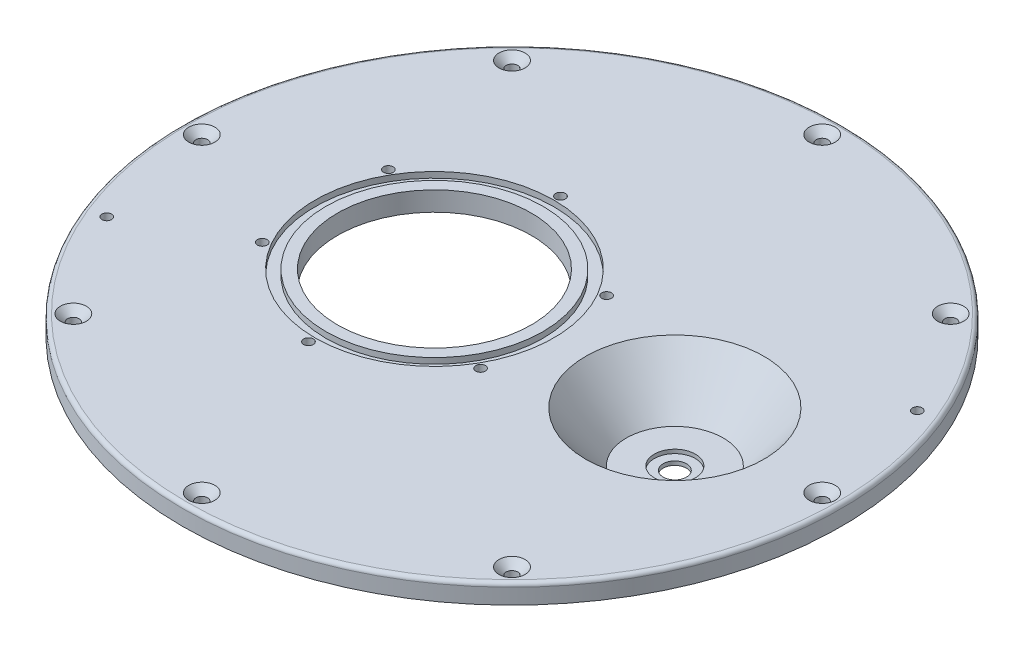
ISO-10303-21;
HEADER;
FILE_DESCRIPTION(('STEP AP214'),'2;1');
FILE_NAME('part.step','',(''),(''),'','','');
FILE_SCHEMA(('AUTOMOTIVE_DESIGN { 1 0 10303 214 1 1 1 1 }'));
ENDSEC;
DATA;
#1=APPLICATION_CONTEXT('core data for automotive mechanical design processes');
#2=APPLICATION_PROTOCOL_DEFINITION('international standard','automotive_design',2000,#1);
#3=PRODUCT_CONTEXT('',#1,'mechanical');
#4=PRODUCT('Part','Part','',(#3));
#5=PRODUCT_RELATED_PRODUCT_CATEGORY('part','',(#4));
#6=PRODUCT_DEFINITION_FORMATION('','',#4);
#7=PRODUCT_DEFINITION_CONTEXT('part definition',#1,'design');
#8=PRODUCT_DEFINITION('design','',#6,#7);
#9=PRODUCT_DEFINITION_SHAPE('','',#8);
#10=(LENGTH_UNIT() NAMED_UNIT(*) SI_UNIT(.MILLI.,.METRE.));
#11=(NAMED_UNIT(*) PLANE_ANGLE_UNIT() SI_UNIT($,.RADIAN.));
#12=(NAMED_UNIT(*) SI_UNIT($,.STERADIAN.) SOLID_ANGLE_UNIT());
#13=UNCERTAINTY_MEASURE_WITH_UNIT(LENGTH_MEASURE(1.E-05),#10,'distance_accuracy_value','');
#14=(GEOMETRIC_REPRESENTATION_CONTEXT(3) GLOBAL_UNCERTAINTY_ASSIGNED_CONTEXT((#13)) GLOBAL_UNIT_ASSIGNED_CONTEXT((#10,
#11,#12)) REPRESENTATION_CONTEXT('',''));
#15=CARTESIAN_POINT('',(0.,0.,0.));
#16=DIRECTION('',(0.,0.,1.));
#17=DIRECTION('',(1.,0.,0.));
#18=AXIS2_PLACEMENT_3D('',#15,#16,#17);
#19=CARTESIAN_POINT('',(0.,5.,0.));
#20=DIRECTION('',(0.,1.,0.));
#21=DIRECTION('',(0.,0.,1.));
#22=AXIS2_PLACEMENT_3D('',#19,#20,#21);
#23=PLANE('',#22);
#24=CARTESIAN_POINT('',(-20.,5.,0.));
#25=DIRECTION('',(0.,1.,0.));
#26=DIRECTION('',(0.,0.,1.));
#27=AXIS2_PLACEMENT_3D('',#24,#25,#26);
#28=CIRCLE('',#27,25.);
#29=CARTESIAN_POINT('',(-20.,5.,25.));
#30=VERTEX_POINT('',#29);
#31=EDGE_CURVE('E147',#30,#30,#28,.T.);
#32=ORIENTED_EDGE('',*,*,#31,.F.);
#33=EDGE_LOOP('',(#32));
#34=FACE_BOUND('',#33,.T.);
#35=CARTESIAN_POINT('',(-20.,5.,0.));
#36=DIRECTION('',(0.,1.,0.));
#37=DIRECTION('',(0.,0.,1.));
#38=AXIS2_PLACEMENT_3D('',#35,#36,#37);
#39=CIRCLE('',#38,28.);
#40=CARTESIAN_POINT('',(-20.,5.,28.));
#41=VERTEX_POINT('',#40);
#42=EDGE_CURVE('E111',#41,#41,#39,.T.);
#43=ORIENTED_EDGE('',*,*,#42,.T.);
#44=EDGE_LOOP('',(#43));
#45=FACE_BOUND('',#44,.T.);
#46=ADVANCED_FACE('F36',(#34,#45),#23,.T.);
#47=CARTESIAN_POINT('',(0.,5.,0.));
#48=DIRECTION('',(0.,-1.,0.));
#49=DIRECTION('',(0.,0.,-1.));
#50=AXIS2_PLACEMENT_3D('',#47,#48,#49);
#51=CYLINDRICAL_SURFACE('',#50,85.);
#52=CARTESIAN_POINT('',(0.,4.,0.));
#53=DIRECTION('',(0.,1.,0.));
#54=DIRECTION('',(0.,0.,1.));
#55=AXIS2_PLACEMENT_3D('',#52,#53,#54);
#56=CIRCLE('',#55,85.);
#57=CARTESIAN_POINT('',(0.,4.,85.));
#58=VERTEX_POINT('',#57);
#59=EDGE_CURVE('E11',#58,#58,#56,.F.);
#60=ORIENTED_EDGE('',*,*,#59,.T.);
#61=EDGE_LOOP('',(#60));
#62=FACE_BOUND('',#61,.T.);
#63=CARTESIAN_POINT('',(0.,0.,0.));
#64=DIRECTION('',(0.,1.,0.));
#65=DIRECTION('',(0.,0.,1.));
#66=AXIS2_PLACEMENT_3D('',#63,#64,#65);
#67=CIRCLE('',#66,85.);
#68=CARTESIAN_POINT('',(0.,0.,85.));
#69=VERTEX_POINT('',#68);
#70=EDGE_CURVE('E225',#69,#69,#67,.T.);
#71=ORIENTED_EDGE('',*,*,#70,.T.);
#72=EDGE_LOOP('',(#71));
#73=FACE_BOUND('',#72,.T.);
#74=ADVANCED_FACE('F249',(#62,#73),#51,.T.);
#75=CARTESIAN_POINT('',(-73.9103626009029,5.,30.6146745892072));
#76=DIRECTION('',(0.,1.,0.));
#77=DIRECTION('',(0.,0.,1.));
#78=AXIS2_PLACEMENT_3D('',#75,#76,#77);
#79=CIRCLE('',#78,1.24999999999999);
#80=CARTESIAN_POINT('',(-73.9103626009029,5.,31.8646745892072));
#81=VERTEX_POINT('',#80);
#82=EDGE_CURVE('E271',#81,#81,#79,.T.);
#83=ORIENTED_EDGE('',*,*,#82,.F.);
#84=EDGE_LOOP('',(#83));
#85=FACE_BOUND('',#84,.T.);
#86=CARTESIAN_POINT('',(73.9103626009029,5.,-30.6146745892073));
#87=DIRECTION('',(0.,1.,0.));
#88=DIRECTION('',(0.,0.,1.));
#89=AXIS2_PLACEMENT_3D('',#86,#87,#88);
#90=CIRCLE('',#89,1.24999999999999);
#91=CARTESIAN_POINT('',(73.9103626009029,5.,-29.3646745892073));
#92=VERTEX_POINT('',#91);
#93=EDGE_CURVE('E275',#92,#92,#90,.T.);
#94=ORIENTED_EDGE('',*,*,#93,.F.);
#95=EDGE_LOOP('',(#94));
#96=FACE_BOUND('',#95,.T.);
#97=CARTESIAN_POINT('',(-20.,5.,-32.5));
#98=DIRECTION('',(0.,1.,0.));
#99=DIRECTION('',(0.,0.,1.));
#100=AXIS2_PLACEMENT_3D('',#97,#98,#99);
#101=CIRCLE('',#100,1.24999999999999);
#102=CARTESIAN_POINT('',(-20.,5.,-31.25));
#103=VERTEX_POINT('',#102);
#104=EDGE_CURVE('E75',#103,#103,#101,.T.);
#105=ORIENTED_EDGE('',*,*,#104,.F.);
#106=EDGE_LOOP('',(#105));
#107=FACE_BOUND('',#106,.T.);
#108=CARTESIAN_POINT('',(8.14582562299452,5.,-16.2500000000003));
#109=DIRECTION('',(0.,1.,0.));
#110=DIRECTION('',(0.,0.,1.));
#111=AXIS2_PLACEMENT_3D('',#108,#109,#110);
#112=CIRCLE('',#111,1.24999999999999);
#113=CARTESIAN_POINT('',(8.14582562299452,5.,-15.0000000000003));
#114=VERTEX_POINT('',#113);
#115=EDGE_CURVE('E74',#114,#114,#112,.T.);
#116=ORIENTED_EDGE('',*,*,#115,.F.);
#117=EDGE_LOOP('',(#116));
#118=FACE_BOUND('',#117,.T.);
#119=CARTESIAN_POINT('',(8.14582562299486,5.,16.2499999999997));
#120=DIRECTION('',(0.,1.,0.));
#121=DIRECTION('',(0.,0.,1.));
#122=AXIS2_PLACEMENT_3D('',#119,#120,#121);
#123=CIRCLE('',#122,1.24999999999999);
#124=CARTESIAN_POINT('',(8.14582562299486,5.,17.4999999999997));
#125=VERTEX_POINT('',#124);
#126=EDGE_CURVE('E87',#125,#125,#123,.T.);
#127=ORIENTED_EDGE('',*,*,#126,.F.);
#128=EDGE_LOOP('',(#127));
#129=FACE_BOUND('',#128,.T.);
#130=CARTESIAN_POINT('',(-19.9999999999993,5.,32.5));
#131=DIRECTION('',(0.,1.,0.));
#132=DIRECTION('',(0.,0.,1.));
#133=AXIS2_PLACEMENT_3D('',#130,#131,#132);
#134=CIRCLE('',#133,1.24999999999999);
#135=CARTESIAN_POINT('',(-19.9999999999993,5.,33.75));
#136=VERTEX_POINT('',#135);
#137=EDGE_CURVE('E93',#136,#136,#134,.T.);
#138=ORIENTED_EDGE('',*,*,#137,.F.);
#139=EDGE_LOOP('',(#138));
#140=FACE_BOUND('',#139,.T.);
#141=CARTESIAN_POINT('',(-48.1458256229938,5.,-16.2499999999999));
#142=DIRECTION('',(0.,1.,0.));
#143=DIRECTION('',(0.,0.,1.));
#144=AXIS2_PLACEMENT_3D('',#141,#142,#143);
#145=CIRCLE('',#144,1.24999999999999);
#146=CARTESIAN_POINT('',(-48.1458256229938,5.,-15.));
#147=VERTEX_POINT('',#146);
#148=EDGE_CURVE('E99',#147,#147,#145,.T.);
#149=ORIENTED_EDGE('',*,*,#148,.F.);
#150=EDGE_LOOP('',(#149));
#151=FACE_BOUND('',#150,.T.);
#152=CARTESIAN_POINT('',(-48.1458256229937,5.,16.2500000000001));
#153=DIRECTION('',(0.,1.,0.));
#154=DIRECTION('',(0.,0.,1.));
#155=AXIS2_PLACEMENT_3D('',#152,#153,#154);
#156=CIRCLE('',#155,1.24999999999999);
#157=CARTESIAN_POINT('',(-48.1458256229937,5.,17.5000000000001));
#158=VERTEX_POINT('',#157);
#159=EDGE_CURVE('E105',#158,#158,#156,.T.);
#160=ORIENTED_EDGE('',*,*,#159,.F.);
#161=EDGE_LOOP('',(#160));
#162=FACE_BOUND('',#161,.T.);
#163=CARTESIAN_POINT('',(0.,5.,0.));
#164=DIRECTION('',(0.,1.,0.));
#165=DIRECTION('',(0.,0.,1.));
#166=AXIS2_PLACEMENT_3D('',#163,#164,#165);
#167=CIRCLE('',#166,84.);
#168=CARTESIAN_POINT('',(0.,5.,84.));
#169=VERTEX_POINT('',#168);
#170=EDGE_CURVE('E45',#169,#169,#167,.T.);
#171=ORIENTED_EDGE('',*,*,#170,.T.);
#172=EDGE_LOOP('',(#171));
#173=FACE_BOUND('',#172,.T.);
#174=CARTESIAN_POINT('',(-20.,5.,0.));
#175=DIRECTION('',(0.,1.,0.));
#176=DIRECTION('',(0.,0.,1.));
#177=AXIS2_PLACEMENT_3D('',#174,#175,#176);
#178=CIRCLE('',#177,30.8);
#179=CARTESIAN_POINT('',(-20.,5.,30.8));
#180=VERTEX_POINT('',#179);
#181=EDGE_CURVE('E115',#180,#180,#178,.T.);
#182=ORIENTED_EDGE('',*,*,#181,.F.);
#183=EDGE_LOOP('',(#182));
#184=FACE_BOUND('',#183,.T.);
#185=CARTESIAN_POINT('',(42.,5.,0.));
#186=DIRECTION('',(0.,1.,0.));
#187=DIRECTION('',(0.,0.,1.));
#188=AXIS2_PLACEMENT_3D('',#185,#186,#187);
#189=CIRCLE('',#188,23.);
#190=CARTESIAN_POINT('',(42.,5.,23.));
#191=VERTEX_POINT('',#190);
#192=EDGE_CURVE('E144',#191,#191,#189,.T.);
#193=ORIENTED_EDGE('',*,*,#192,.F.);
#194=EDGE_LOOP('',(#193));
#195=FACE_BOUND('',#194,.T.);
#196=CARTESIAN_POINT('',(0.,5.,-80.));
#197=DIRECTION('',(0.,1.,0.));
#198=DIRECTION('',(0.,0.,1.));
#199=AXIS2_PLACEMENT_3D('',#196,#197,#198);
#200=CIRCLE('',#199,3.36);
#201=CARTESIAN_POINT('',(0.,5.,-76.64));
#202=VERTEX_POINT('',#201);
#203=EDGE_CURVE('E151',#202,#202,#200,.T.);
#204=ORIENTED_EDGE('',*,*,#203,.F.);
#205=EDGE_LOOP('',(#204));
#206=FACE_BOUND('',#205,.T.);
#207=CARTESIAN_POINT('',(56.5685424949239,5.,-56.5685424949237));
#208=DIRECTION('',(0.,1.,0.));
#209=DIRECTION('',(0.,0.,1.));
#210=AXIS2_PLACEMENT_3D('',#207,#208,#209);
#211=CIRCLE('',#210,3.36);
#212=CARTESIAN_POINT('',(56.5685424949239,5.,-53.2085424949237));
#213=VERTEX_POINT('',#212);
#214=EDGE_CURVE('E162',#213,#213,#211,.T.);
#215=ORIENTED_EDGE('',*,*,#214,.F.);
#216=EDGE_LOOP('',(#215));
#217=FACE_BOUND('',#216,.T.);
#218=CARTESIAN_POINT('',(80.,5.,2.79318507107451E-13));
#219=DIRECTION('',(0.,1.,0.));
#220=DIRECTION('',(0.,0.,1.));
#221=AXIS2_PLACEMENT_3D('',#218,#219,#220);
#222=CIRCLE('',#221,3.36);
#223=CARTESIAN_POINT('',(80.,5.,3.36000000000028));
#224=VERTEX_POINT('',#223);
#225=EDGE_CURVE('E171',#224,#224,#222,.T.);
#226=ORIENTED_EDGE('',*,*,#225,.F.);
#227=EDGE_LOOP('',(#226));
#228=FACE_BOUND('',#227,.T.);
#229=CARTESIAN_POINT('',(56.5685424949235,5.,56.5685424949241));
#230=DIRECTION('',(0.,1.,0.));
#231=DIRECTION('',(0.,0.,1.));
#232=AXIS2_PLACEMENT_3D('',#229,#230,#231);
#233=CIRCLE('',#232,3.36);
#234=CARTESIAN_POINT('',(56.5685424949235,5.,59.9285424949241));
#235=VERTEX_POINT('',#234);
#236=EDGE_CURVE('E180',#235,#235,#233,.T.);
#237=ORIENTED_EDGE('',*,*,#236,.F.);
#238=EDGE_LOOP('',(#237));
#239=FACE_BOUND('',#238,.T.);
#240=CARTESIAN_POINT('',(-5.58637014214901E-13,5.,80.));
#241=DIRECTION('',(0.,1.,0.));
#242=DIRECTION('',(0.,0.,1.));
#243=AXIS2_PLACEMENT_3D('',#240,#241,#242);
#244=CIRCLE('',#243,3.36);
#245=CARTESIAN_POINT('',(-5.58637014214901E-13,5.,83.36));
#246=VERTEX_POINT('',#245);
#247=EDGE_CURVE('E189',#246,#246,#244,.T.);
#248=ORIENTED_EDGE('',*,*,#247,.F.);
#249=EDGE_LOOP('',(#248));
#250=FACE_BOUND('',#249,.T.);
#251=CARTESIAN_POINT('',(-56.5685424949243,5.,56.5685424949233));
#252=DIRECTION('',(0.,1.,0.));
#253=DIRECTION('',(0.,0.,1.));
#254=AXIS2_PLACEMENT_3D('',#251,#252,#253);
#255=CIRCLE('',#254,3.36);
#256=CARTESIAN_POINT('',(-56.5685424949243,5.,59.9285424949233));
#257=VERTEX_POINT('',#256);
#258=EDGE_CURVE('E198',#257,#257,#255,.T.);
#259=ORIENTED_EDGE('',*,*,#258,.F.);
#260=EDGE_LOOP('',(#259));
#261=FACE_BOUND('',#260,.T.);
#262=CARTESIAN_POINT('',(-56.5685424949231,5.,-56.5685424949245));
#263=DIRECTION('',(0.,1.,0.));
#264=DIRECTION('',(0.,0.,1.));
#265=AXIS2_PLACEMENT_3D('',#262,#263,#264);
#266=CIRCLE('',#265,3.36);
#267=CARTESIAN_POINT('',(-56.5685424949231,5.,-53.2085424949245));
#268=VERTEX_POINT('',#267);
#269=EDGE_CURVE('E207',#268,#268,#266,.T.);
#270=ORIENTED_EDGE('',*,*,#269,.F.);
#271=EDGE_LOOP('',(#270));
#272=FACE_BOUND('',#271,.T.);
#273=CARTESIAN_POINT('',(-80.,5.,-8.37955521322352E-13));
#274=DIRECTION('',(0.,1.,0.));
#275=DIRECTION('',(0.,0.,1.));
#276=AXIS2_PLACEMENT_3D('',#273,#274,#275);
#277=CIRCLE('',#276,3.36);
#278=CARTESIAN_POINT('',(-80.,5.,3.35999999999916));
#279=VERTEX_POINT('',#278);
#280=EDGE_CURVE('E216',#279,#279,#277,.T.);
#281=ORIENTED_EDGE('',*,*,#280,.F.);
#282=EDGE_LOOP('',(#281));
#283=FACE_BOUND('',#282,.T.);
#284=ADVANCED_FACE('F231',(#85,#96,#107,#118,#129,#140,#151,#162,#173,#184,#195,#206,#217,#228,
#239,#250,#261,#272,#283),#23,.T.);
#285=CARTESIAN_POINT('',(0.,0.,0.));
#286=DIRECTION('',(0.,1.,0.));
#287=DIRECTION('',(0.,0.,1.));
#288=AXIS2_PLACEMENT_3D('',#285,#286,#287);
#289=PLANE('',#288);
#290=CARTESIAN_POINT('',(-73.9103626009029,0.,30.6146745892072));
#291=DIRECTION('',(0.,1.,0.));
#292=DIRECTION('',(0.,0.,1.));
#293=AXIS2_PLACEMENT_3D('',#290,#291,#292);
#294=CIRCLE('',#293,1.24999999999999);
#295=CARTESIAN_POINT('',(-73.9103626009029,0.,31.8646745892072));
#296=VERTEX_POINT('',#295);
#297=EDGE_CURVE('E40',#296,#296,#294,.T.);
#298=ORIENTED_EDGE('',*,*,#297,.T.);
#299=EDGE_LOOP('',(#298));
#300=FACE_BOUND('',#299,.T.);
#301=CARTESIAN_POINT('',(73.9103626009029,0.,-30.6146745892073));
#302=DIRECTION('',(0.,1.,0.));
#303=DIRECTION('',(0.,0.,1.));
#304=AXIS2_PLACEMENT_3D('',#301,#302,#303);
#305=CIRCLE('',#304,1.24999999999999);
#306=CARTESIAN_POINT('',(73.9103626009029,0.,-29.3646745892073));
#307=VERTEX_POINT('',#306);
#308=EDGE_CURVE('E81',#307,#307,#305,.T.);
#309=ORIENTED_EDGE('',*,*,#308,.T.);
#310=EDGE_LOOP('',(#309));
#311=FACE_BOUND('',#310,.T.);
#312=CARTESIAN_POINT('',(42.,0.,0.));
#313=DIRECTION('',(0.,1.,0.));
#314=DIRECTION('',(0.,0.,1.));
#315=AXIS2_PLACEMENT_3D('',#312,#313,#314);
#316=CIRCLE('',#315,23.);
#317=CARTESIAN_POINT('',(42.,0.,23.));
#318=VERTEX_POINT('',#317);
#319=EDGE_CURVE('E121',#318,#318,#316,.T.);
#320=ORIENTED_EDGE('',*,*,#319,.T.);
#321=EDGE_LOOP('',(#320));
#322=FACE_BOUND('',#321,.T.);
#323=CARTESIAN_POINT('',(-20.,0.,0.));
#324=DIRECTION('',(0.,1.,0.));
#325=DIRECTION('',(0.,0.,1.));
#326=AXIS2_PLACEMENT_3D('',#323,#324,#325);
#327=CIRCLE('',#326,25.);
#328=CARTESIAN_POINT('',(-20.,0.,25.));
#329=VERTEX_POINT('',#328);
#330=EDGE_CURVE('E148',#329,#329,#327,.T.);
#331=ORIENTED_EDGE('',*,*,#330,.T.);
#332=EDGE_LOOP('',(#331));
#333=FACE_BOUND('',#332,.T.);
#334=CARTESIAN_POINT('',(0.,0.,-80.));
#335=DIRECTION('',(0.,1.,0.));
#336=DIRECTION('',(0.,0.,1.));
#337=AXIS2_PLACEMENT_3D('',#334,#335,#336);
#338=CIRCLE('',#337,1.5);
#339=CARTESIAN_POINT('',(0.,0.,-78.5));
#340=VERTEX_POINT('',#339);
#341=EDGE_CURVE('E159',#340,#340,#338,.T.);
#342=ORIENTED_EDGE('',*,*,#341,.T.);
#343=EDGE_LOOP('',(#342));
#344=FACE_BOUND('',#343,.T.);
#345=CARTESIAN_POINT('',(56.5685424949239,0.,-56.5685424949237));
#346=DIRECTION('',(0.,1.,0.));
#347=DIRECTION('',(0.,0.,1.));
#348=AXIS2_PLACEMENT_3D('',#345,#346,#347);
#349=CIRCLE('',#348,1.5);
#350=CARTESIAN_POINT('',(56.5685424949239,0.,-55.0685424949237));
#351=VERTEX_POINT('',#350);
#352=EDGE_CURVE('E168',#351,#351,#349,.T.);
#353=ORIENTED_EDGE('',*,*,#352,.T.);
#354=EDGE_LOOP('',(#353));
#355=FACE_BOUND('',#354,.T.);
#356=CARTESIAN_POINT('',(80.,0.,2.79318507107451E-13));
#357=DIRECTION('',(0.,1.,0.));
#358=DIRECTION('',(0.,0.,1.));
#359=AXIS2_PLACEMENT_3D('',#356,#357,#358);
#360=CIRCLE('',#359,1.5);
#361=CARTESIAN_POINT('',(80.,0.,1.50000000000028));
#362=VERTEX_POINT('',#361);
#363=EDGE_CURVE('E177',#362,#362,#360,.T.);
#364=ORIENTED_EDGE('',*,*,#363,.T.);
#365=EDGE_LOOP('',(#364));
#366=FACE_BOUND('',#365,.T.);
#367=CARTESIAN_POINT('',(56.5685424949235,0.,56.5685424949241));
#368=DIRECTION('',(0.,1.,0.));
#369=DIRECTION('',(0.,0.,1.));
#370=AXIS2_PLACEMENT_3D('',#367,#368,#369);
#371=CIRCLE('',#370,1.5);
#372=CARTESIAN_POINT('',(56.5685424949235,0.,58.0685424949241));
#373=VERTEX_POINT('',#372);
#374=EDGE_CURVE('E186',#373,#373,#371,.T.);
#375=ORIENTED_EDGE('',*,*,#374,.T.);
#376=EDGE_LOOP('',(#375));
#377=FACE_BOUND('',#376,.T.);
#378=CARTESIAN_POINT('',(-5.58637014214901E-13,0.,80.));
#379=DIRECTION('',(0.,1.,0.));
#380=DIRECTION('',(0.,0.,1.));
#381=AXIS2_PLACEMENT_3D('',#378,#379,#380);
#382=CIRCLE('',#381,1.5);
#383=CARTESIAN_POINT('',(-5.58637014214901E-13,0.,81.5));
#384=VERTEX_POINT('',#383);
#385=EDGE_CURVE('E195',#384,#384,#382,.T.);
#386=ORIENTED_EDGE('',*,*,#385,.T.);
#387=EDGE_LOOP('',(#386));
#388=FACE_BOUND('',#387,.T.);
#389=CARTESIAN_POINT('',(-56.5685424949243,0.,56.5685424949233));
#390=DIRECTION('',(0.,1.,0.));
#391=DIRECTION('',(0.,0.,1.));
#392=AXIS2_PLACEMENT_3D('',#389,#390,#391);
#393=CIRCLE('',#392,1.5);
#394=CARTESIAN_POINT('',(-56.5685424949243,0.,58.0685424949233));
#395=VERTEX_POINT('',#394);
#396=EDGE_CURVE('E204',#395,#395,#393,.T.);
#397=ORIENTED_EDGE('',*,*,#396,.T.);
#398=EDGE_LOOP('',(#397));
#399=FACE_BOUND('',#398,.T.);
#400=CARTESIAN_POINT('',(-56.5685424949231,0.,-56.5685424949245));
#401=DIRECTION('',(0.,1.,0.));
#402=DIRECTION('',(0.,0.,1.));
#403=AXIS2_PLACEMENT_3D('',#400,#401,#402);
#404=CIRCLE('',#403,1.5);
#405=CARTESIAN_POINT('',(-56.5685424949231,0.,-55.0685424949245));
#406=VERTEX_POINT('',#405);
#407=EDGE_CURVE('E213',#406,#406,#404,.T.);
#408=ORIENTED_EDGE('',*,*,#407,.T.);
#409=EDGE_LOOP('',(#408));
#410=FACE_BOUND('',#409,.T.);
#411=CARTESIAN_POINT('',(-80.,0.,-8.37955521322352E-13));
#412=DIRECTION('',(0.,1.,0.));
#413=DIRECTION('',(0.,0.,1.));
#414=AXIS2_PLACEMENT_3D('',#411,#412,#413);
#415=CIRCLE('',#414,1.5);
#416=CARTESIAN_POINT('',(-80.,0.,1.49999999999916));
#417=VERTEX_POINT('',#416);
#418=EDGE_CURVE('E222',#417,#417,#415,.T.);
#419=ORIENTED_EDGE('',*,*,#418,.T.);
#420=EDGE_LOOP('',(#419));
#421=FACE_BOUND('',#420,.T.);
#422=ORIENTED_EDGE('',*,*,#70,.F.);
#423=EDGE_LOOP('',(#422));
#424=FACE_BOUND('',#423,.T.);
#425=ADVANCED_FACE('F261',(#300,#311,#322,#333,#344,#355,#366,#377,#388,#399,#410,#421,#424),
#289,.F.);
#426=CARTESIAN_POINT('',(-80.,5.,-8.37955521322352E-13));
#427=DIRECTION('',(0.,1.,0.));
#428=DIRECTION('',(0.,0.,1.));
#429=AXIS2_PLACEMENT_3D('',#426,#427,#428);
#430=CYLINDRICAL_SURFACE('',#429,1.5);
#431=ORIENTED_EDGE('',*,*,#418,.F.);
#432=EDGE_LOOP('',(#431));
#433=FACE_BOUND('',#432,.T.);
#434=CARTESIAN_POINT('',(-80.,3.14,-8.37955521322352E-13));
#435=DIRECTION('',(0.,1.,0.));
#436=DIRECTION('',(0.,0.,1.));
#437=AXIS2_PLACEMENT_3D('',#434,#435,#436);
#438=CIRCLE('',#437,1.5);
#439=CARTESIAN_POINT('',(-80.,3.14,1.49999999999916));
#440=VERTEX_POINT('',#439);
#441=EDGE_CURVE('E219',#440,#440,#438,.T.);
#442=ORIENTED_EDGE('',*,*,#441,.T.);
#443=EDGE_LOOP('',(#442));
#444=FACE_BOUND('',#443,.T.);
#445=ADVANCED_FACE('F266',(#433,#444),#430,.F.);
#446=CARTESIAN_POINT('',(-80.,5.,-8.37955521322352E-13));
#447=DIRECTION('',(0.,1.,0.));
#448=DIRECTION('',(0.,0.,1.));
#449=AXIS2_PLACEMENT_3D('',#446,#447,#448);
#450=CONICAL_SURFACE('',#449,3.36,0.785398163397448);
#451=ORIENTED_EDGE('',*,*,#441,.F.);
#452=EDGE_LOOP('',(#451));
#453=FACE_BOUND('',#452,.T.);
#454=ORIENTED_EDGE('',*,*,#280,.T.);
#455=EDGE_LOOP('',(#454));
#456=FACE_BOUND('',#455,.T.);
#457=ADVANCED_FACE('F394',(#453,#456),#450,.F.);
#458=CARTESIAN_POINT('',(-56.5685424949231,5.,-56.5685424949245));
#459=DIRECTION('',(0.,1.,0.));
#460=DIRECTION('',(0.,0.,1.));
#461=AXIS2_PLACEMENT_3D('',#458,#459,#460);
#462=CYLINDRICAL_SURFACE('',#461,1.5);
#463=ORIENTED_EDGE('',*,*,#407,.F.);
#464=EDGE_LOOP('',(#463));
#465=FACE_BOUND('',#464,.T.);
#466=CARTESIAN_POINT('',(-56.5685424949231,3.14,-56.5685424949245));
#467=DIRECTION('',(0.,1.,0.));
#468=DIRECTION('',(0.,0.,1.));
#469=AXIS2_PLACEMENT_3D('',#466,#467,#468);
#470=CIRCLE('',#469,1.5);
#471=CARTESIAN_POINT('',(-56.5685424949231,3.14,-55.0685424949245));
#472=VERTEX_POINT('',#471);
#473=EDGE_CURVE('E210',#472,#472,#470,.T.);
#474=ORIENTED_EDGE('',*,*,#473,.T.);
#475=EDGE_LOOP('',(#474));
#476=FACE_BOUND('',#475,.T.);
#477=ADVANCED_FACE('F390',(#465,#476),#462,.F.);
#478=CARTESIAN_POINT('',(-56.5685424949231,5.,-56.5685424949245));
#479=DIRECTION('',(0.,1.,0.));
#480=DIRECTION('',(0.,0.,1.));
#481=AXIS2_PLACEMENT_3D('',#478,#479,#480);
#482=CONICAL_SURFACE('',#481,3.36,0.785398163397448);
#483=ORIENTED_EDGE('',*,*,#473,.F.);
#484=EDGE_LOOP('',(#483));
#485=FACE_BOUND('',#484,.T.);
#486=ORIENTED_EDGE('',*,*,#269,.T.);
#487=EDGE_LOOP('',(#486));
#488=FACE_BOUND('',#487,.T.);
#489=ADVANCED_FACE('F386',(#485,#488),#482,.F.);
#490=CARTESIAN_POINT('',(-56.5685424949243,5.,56.5685424949233));
#491=DIRECTION('',(0.,1.,0.));
#492=DIRECTION('',(0.,0.,1.));
#493=AXIS2_PLACEMENT_3D('',#490,#491,#492);
#494=CYLINDRICAL_SURFACE('',#493,1.5);
#495=ORIENTED_EDGE('',*,*,#396,.F.);
#496=EDGE_LOOP('',(#495));
#497=FACE_BOUND('',#496,.T.);
#498=CARTESIAN_POINT('',(-56.5685424949243,3.14,56.5685424949233));
#499=DIRECTION('',(0.,1.,0.));
#500=DIRECTION('',(0.,0.,1.));
#501=AXIS2_PLACEMENT_3D('',#498,#499,#500);
#502=CIRCLE('',#501,1.5);
#503=CARTESIAN_POINT('',(-56.5685424949243,3.14,58.0685424949233));
#504=VERTEX_POINT('',#503);
#505=EDGE_CURVE('E201',#504,#504,#502,.T.);
#506=ORIENTED_EDGE('',*,*,#505,.T.);
#507=EDGE_LOOP('',(#506));
#508=FACE_BOUND('',#507,.T.);
#509=ADVANCED_FACE('F382',(#497,#508),#494,.F.);
#510=CARTESIAN_POINT('',(-56.5685424949243,5.,56.5685424949233));
#511=DIRECTION('',(0.,1.,0.));
#512=DIRECTION('',(0.,0.,1.));
#513=AXIS2_PLACEMENT_3D('',#510,#511,#512);
#514=CONICAL_SURFACE('',#513,3.36,0.785398163397448);
#515=ORIENTED_EDGE('',*,*,#505,.F.);
#516=EDGE_LOOP('',(#515));
#517=FACE_BOUND('',#516,.T.);
#518=ORIENTED_EDGE('',*,*,#258,.T.);
#519=EDGE_LOOP('',(#518));
#520=FACE_BOUND('',#519,.T.);
#521=ADVANCED_FACE('F378',(#517,#520),#514,.F.);
#522=CARTESIAN_POINT('',(-5.58637014214901E-13,5.,80.));
#523=DIRECTION('',(0.,1.,0.));
#524=DIRECTION('',(0.,0.,1.));
#525=AXIS2_PLACEMENT_3D('',#522,#523,#524);
#526=CYLINDRICAL_SURFACE('',#525,1.5);
#527=ORIENTED_EDGE('',*,*,#385,.F.);
#528=EDGE_LOOP('',(#527));
#529=FACE_BOUND('',#528,.T.);
#530=CARTESIAN_POINT('',(-5.58637014214901E-13,3.14,80.));
#531=DIRECTION('',(0.,1.,0.));
#532=DIRECTION('',(0.,0.,1.));
#533=AXIS2_PLACEMENT_3D('',#530,#531,#532);
#534=CIRCLE('',#533,1.5);
#535=CARTESIAN_POINT('',(-5.58637014214901E-13,3.14,81.5));
#536=VERTEX_POINT('',#535);
#537=EDGE_CURVE('E192',#536,#536,#534,.T.);
#538=ORIENTED_EDGE('',*,*,#537,.T.);
#539=EDGE_LOOP('',(#538));
#540=FACE_BOUND('',#539,.T.);
#541=ADVANCED_FACE('F374',(#529,#540),#526,.F.);
#542=CARTESIAN_POINT('',(-5.58637014214901E-13,5.,80.));
#543=DIRECTION('',(0.,1.,0.));
#544=DIRECTION('',(0.,0.,1.));
#545=AXIS2_PLACEMENT_3D('',#542,#543,#544);
#546=CONICAL_SURFACE('',#545,3.36,0.785398163397448);
#547=ORIENTED_EDGE('',*,*,#537,.F.);
#548=EDGE_LOOP('',(#547));
#549=FACE_BOUND('',#548,.T.);
#550=ORIENTED_EDGE('',*,*,#247,.T.);
#551=EDGE_LOOP('',(#550));
#552=FACE_BOUND('',#551,.T.);
#553=ADVANCED_FACE('F370',(#549,#552),#546,.F.);
#554=CARTESIAN_POINT('',(56.5685424949235,5.,56.5685424949241));
#555=DIRECTION('',(0.,1.,0.));
#556=DIRECTION('',(0.,0.,1.));
#557=AXIS2_PLACEMENT_3D('',#554,#555,#556);
#558=CYLINDRICAL_SURFACE('',#557,1.5);
#559=ORIENTED_EDGE('',*,*,#374,.F.);
#560=EDGE_LOOP('',(#559));
#561=FACE_BOUND('',#560,.T.);
#562=CARTESIAN_POINT('',(56.5685424949235,3.14,56.5685424949241));
#563=DIRECTION('',(0.,1.,0.));
#564=DIRECTION('',(0.,0.,1.));
#565=AXIS2_PLACEMENT_3D('',#562,#563,#564);
#566=CIRCLE('',#565,1.5);
#567=CARTESIAN_POINT('',(56.5685424949235,3.14,58.0685424949241));
#568=VERTEX_POINT('',#567);
#569=EDGE_CURVE('E183',#568,#568,#566,.T.);
#570=ORIENTED_EDGE('',*,*,#569,.T.);
#571=EDGE_LOOP('',(#570));
#572=FACE_BOUND('',#571,.T.);
#573=ADVANCED_FACE('F366',(#561,#572),#558,.F.);
#574=CARTESIAN_POINT('',(56.5685424949235,5.,56.5685424949241));
#575=DIRECTION('',(0.,1.,0.));
#576=DIRECTION('',(0.,0.,1.));
#577=AXIS2_PLACEMENT_3D('',#574,#575,#576);
#578=CONICAL_SURFACE('',#577,3.36,0.785398163397448);
#579=ORIENTED_EDGE('',*,*,#569,.F.);
#580=EDGE_LOOP('',(#579));
#581=FACE_BOUND('',#580,.T.);
#582=ORIENTED_EDGE('',*,*,#236,.T.);
#583=EDGE_LOOP('',(#582));
#584=FACE_BOUND('',#583,.T.);
#585=ADVANCED_FACE('F362',(#581,#584),#578,.F.);
#586=CARTESIAN_POINT('',(80.,5.,2.79318507107451E-13));
#587=DIRECTION('',(0.,1.,0.));
#588=DIRECTION('',(0.,0.,1.));
#589=AXIS2_PLACEMENT_3D('',#586,#587,#588);
#590=CYLINDRICAL_SURFACE('',#589,1.5);
#591=ORIENTED_EDGE('',*,*,#363,.F.);
#592=EDGE_LOOP('',(#591));
#593=FACE_BOUND('',#592,.T.);
#594=CARTESIAN_POINT('',(80.,3.14,2.79318507107451E-13));
#595=DIRECTION('',(0.,1.,0.));
#596=DIRECTION('',(0.,0.,1.));
#597=AXIS2_PLACEMENT_3D('',#594,#595,#596);
#598=CIRCLE('',#597,1.5);
#599=CARTESIAN_POINT('',(80.,3.14,1.50000000000028));
#600=VERTEX_POINT('',#599);
#601=EDGE_CURVE('E174',#600,#600,#598,.T.);
#602=ORIENTED_EDGE('',*,*,#601,.T.);
#603=EDGE_LOOP('',(#602));
#604=FACE_BOUND('',#603,.T.);
#605=ADVANCED_FACE('F358',(#593,#604),#590,.F.);
#606=CARTESIAN_POINT('',(80.,5.,2.79318507107451E-13));
#607=DIRECTION('',(0.,1.,0.));
#608=DIRECTION('',(0.,0.,1.));
#609=AXIS2_PLACEMENT_3D('',#606,#607,#608);
#610=CONICAL_SURFACE('',#609,3.36,0.785398163397448);
#611=ORIENTED_EDGE('',*,*,#601,.F.);
#612=EDGE_LOOP('',(#611));
#613=FACE_BOUND('',#612,.T.);
#614=ORIENTED_EDGE('',*,*,#225,.T.);
#615=EDGE_LOOP('',(#614));
#616=FACE_BOUND('',#615,.T.);
#617=ADVANCED_FACE('F354',(#613,#616),#610,.F.);
#618=CARTESIAN_POINT('',(56.5685424949239,5.,-56.5685424949237));
#619=DIRECTION('',(0.,1.,0.));
#620=DIRECTION('',(0.,0.,1.));
#621=AXIS2_PLACEMENT_3D('',#618,#619,#620);
#622=CYLINDRICAL_SURFACE('',#621,1.5);
#623=ORIENTED_EDGE('',*,*,#352,.F.);
#624=EDGE_LOOP('',(#623));
#625=FACE_BOUND('',#624,.T.);
#626=CARTESIAN_POINT('',(56.5685424949239,3.14,-56.5685424949237));
#627=DIRECTION('',(0.,1.,0.));
#628=DIRECTION('',(0.,0.,1.));
#629=AXIS2_PLACEMENT_3D('',#626,#627,#628);
#630=CIRCLE('',#629,1.5);
#631=CARTESIAN_POINT('',(56.5685424949239,3.14,-55.0685424949237));
#632=VERTEX_POINT('',#631);
#633=EDGE_CURVE('E165',#632,#632,#630,.T.);
#634=ORIENTED_EDGE('',*,*,#633,.T.);
#635=EDGE_LOOP('',(#634));
#636=FACE_BOUND('',#635,.T.);
#637=ADVANCED_FACE('F350',(#625,#636),#622,.F.);
#638=CARTESIAN_POINT('',(56.5685424949239,5.,-56.5685424949237));
#639=DIRECTION('',(0.,1.,0.));
#640=DIRECTION('',(0.,0.,1.));
#641=AXIS2_PLACEMENT_3D('',#638,#639,#640);
#642=CONICAL_SURFACE('',#641,3.36,0.785398163397448);
#643=ORIENTED_EDGE('',*,*,#633,.F.);
#644=EDGE_LOOP('',(#643));
#645=FACE_BOUND('',#644,.T.);
#646=ORIENTED_EDGE('',*,*,#214,.T.);
#647=EDGE_LOOP('',(#646));
#648=FACE_BOUND('',#647,.T.);
#649=ADVANCED_FACE('F346',(#645,#648),#642,.F.);
#650=CARTESIAN_POINT('',(0.,5.,-80.));
#651=DIRECTION('',(0.,1.,0.));
#652=DIRECTION('',(0.,0.,1.));
#653=AXIS2_PLACEMENT_3D('',#650,#651,#652);
#654=CYLINDRICAL_SURFACE('',#653,1.5);
#655=ORIENTED_EDGE('',*,*,#341,.F.);
#656=EDGE_LOOP('',(#655));
#657=FACE_BOUND('',#656,.T.);
#658=CARTESIAN_POINT('',(0.,3.14,-80.));
#659=DIRECTION('',(0.,1.,0.));
#660=DIRECTION('',(0.,0.,1.));
#661=AXIS2_PLACEMENT_3D('',#658,#659,#660);
#662=CIRCLE('',#661,1.5);
#663=CARTESIAN_POINT('',(0.,3.14,-78.5));
#664=VERTEX_POINT('',#663);
#665=EDGE_CURVE('E156',#664,#664,#662,.T.);
#666=ORIENTED_EDGE('',*,*,#665,.T.);
#667=EDGE_LOOP('',(#666));
#668=FACE_BOUND('',#667,.T.);
#669=ADVANCED_FACE('F342',(#657,#668),#654,.F.);
#670=CARTESIAN_POINT('',(0.,5.,-80.));
#671=DIRECTION('',(0.,1.,0.));
#672=DIRECTION('',(0.,0.,1.));
#673=AXIS2_PLACEMENT_3D('',#670,#671,#672);
#674=CONICAL_SURFACE('',#673,3.36,0.785398163397448);
#675=ORIENTED_EDGE('',*,*,#665,.F.);
#676=EDGE_LOOP('',(#675));
#677=FACE_BOUND('',#676,.T.);
#678=ORIENTED_EDGE('',*,*,#203,.T.);
#679=EDGE_LOOP('',(#678));
#680=FACE_BOUND('',#679,.T.);
#681=ADVANCED_FACE('F338',(#677,#680),#674,.F.);
#682=CARTESIAN_POINT('',(-20.,0.,0.));
#683=DIRECTION('',(0.,1.,0.));
#684=DIRECTION('',(0.,0.,1.));
#685=AXIS2_PLACEMENT_3D('',#682,#683,#684);
#686=CYLINDRICAL_SURFACE('',#685,25.);
#687=ORIENTED_EDGE('',*,*,#330,.F.);
#688=EDGE_LOOP('',(#687));
#689=FACE_BOUND('',#688,.T.);
#690=ORIENTED_EDGE('',*,*,#31,.T.);
#691=EDGE_LOOP('',(#690));
#692=FACE_BOUND('',#691,.T.);
#693=ADVANCED_FACE('F334',(#689,#692),#686,.F.);
#694=CARTESIAN_POINT('',(42.,5.00000000000002,0.));
#695=DIRECTION('',(0.,1.,0.));
#696=DIRECTION('',(0.,0.,1.));
#697=AXIS2_PLACEMENT_3D('',#694,#695,#696);
#698=CONICAL_SURFACE('',#697,23.,0.679413805407848);
#699=CARTESIAN_POINT('',(42.,-8.,0.));
#700=DIRECTION('',(0.,1.,0.));
#701=DIRECTION('',(0.,0.,1.));
#702=AXIS2_PLACEMENT_3D('',#699,#700,#701);
#703=CIRCLE('',#702,12.5);
#704=CARTESIAN_POINT('',(42.,-8.,12.5));
#705=VERTEX_POINT('',#704);
#706=EDGE_CURVE('E141',#705,#705,#703,.T.);
#707=ORIENTED_EDGE('',*,*,#706,.F.);
#708=EDGE_LOOP('',(#707));
#709=FACE_BOUND('',#708,.T.);
#710=ORIENTED_EDGE('',*,*,#192,.T.);
#711=EDGE_LOOP('',(#710));
#712=FACE_BOUND('',#711,.T.);
#713=ADVANCED_FACE('F330',(#709,#712),#698,.F.);
#714=CARTESIAN_POINT('',(29.5,-8.,0.));
#715=DIRECTION('',(0.,-1.,0.));
#716=DIRECTION('',(0.,0.,-1.));
#717=AXIS2_PLACEMENT_3D('',#714,#715,#716);
#718=PLANE('',#717);
#719=CARTESIAN_POINT('',(42.,-8.,0.));
#720=DIRECTION('',(0.,1.,0.));
#721=DIRECTION('',(0.,0.,1.));
#722=AXIS2_PLACEMENT_3D('',#719,#720,#721);
#723=CIRCLE('',#722,5.30000000000001);
#724=CARTESIAN_POINT('',(42.,-8.,5.30000000000001));
#725=VERTEX_POINT('',#724);
#726=EDGE_CURVE('E138',#725,#725,#723,.T.);
#727=ORIENTED_EDGE('',*,*,#726,.F.);
#728=EDGE_LOOP('',(#727));
#729=FACE_BOUND('',#728,.T.);
#730=ORIENTED_EDGE('',*,*,#706,.T.);
#731=EDGE_LOOP('',(#730));
#732=FACE_BOUND('',#731,.T.);
#733=ADVANCED_FACE('F326',(#729,#732),#718,.F.);
#734=CARTESIAN_POINT('',(42.,0.,0.));
#735=DIRECTION('',(0.,1.,0.));
#736=DIRECTION('',(0.,0.,1.));
#737=AXIS2_PLACEMENT_3D('',#734,#735,#736);
#738=CYLINDRICAL_SURFACE('',#737,5.30000000000001);
#739=CARTESIAN_POINT('',(42.,-9.,0.));
#740=DIRECTION('',(0.,1.,0.));
#741=DIRECTION('',(0.,0.,1.));
#742=AXIS2_PLACEMENT_3D('',#739,#740,#741);
#743=CIRCLE('',#742,5.30000000000001);
#744=CARTESIAN_POINT('',(42.,-9.,5.30000000000001));
#745=VERTEX_POINT('',#744);
#746=EDGE_CURVE('E135',#745,#745,#743,.T.);
#747=ORIENTED_EDGE('',*,*,#746,.F.);
#748=EDGE_LOOP('',(#747));
#749=FACE_BOUND('',#748,.T.);
#750=ORIENTED_EDGE('',*,*,#726,.T.);
#751=EDGE_LOOP('',(#750));
#752=FACE_BOUND('',#751,.T.);
#753=ADVANCED_FACE('F322',(#749,#752),#738,.F.);
#754=CARTESIAN_POINT('',(36.7,-9.,0.));
#755=DIRECTION('',(0.,-1.,0.));
#756=DIRECTION('',(0.,0.,-1.));
#757=AXIS2_PLACEMENT_3D('',#754,#755,#756);
#758=PLANE('',#757);
#759=CARTESIAN_POINT('',(42.,-9.,0.));
#760=DIRECTION('',(0.,1.,0.));
#761=DIRECTION('',(0.,0.,1.));
#762=AXIS2_PLACEMENT_3D('',#759,#760,#761);
#763=CIRCLE('',#762,3.);
#764=CARTESIAN_POINT('',(42.,-9.,3.));
#765=VERTEX_POINT('',#764);
#766=EDGE_CURVE('E132',#765,#765,#763,.T.);
#767=ORIENTED_EDGE('',*,*,#766,.F.);
#768=EDGE_LOOP('',(#767));
#769=FACE_BOUND('',#768,.T.);
#770=ORIENTED_EDGE('',*,*,#746,.T.);
#771=EDGE_LOOP('',(#770));
#772=FACE_BOUND('',#771,.T.);
#773=ADVANCED_FACE('F318',(#769,#772),#758,.F.);
#774=CARTESIAN_POINT('',(42.,0.,0.));
#775=DIRECTION('',(0.,1.,0.));
#776=DIRECTION('',(0.,0.,1.));
#777=AXIS2_PLACEMENT_3D('',#774,#775,#776);
#778=CYLINDRICAL_SURFACE('',#777,3.);
#779=ORIENTED_EDGE('',*,*,#766,.T.);
#780=EDGE_LOOP('',(#779));
#781=FACE_BOUND('',#780,.T.);
#782=CARTESIAN_POINT('',(42.,-10.,0.));
#783=DIRECTION('',(0.,1.,0.));
#784=DIRECTION('',(0.,0.,1.));
#785=AXIS2_PLACEMENT_3D('',#782,#783,#784);
#786=CIRCLE('',#785,3.);
#787=CARTESIAN_POINT('',(42.,-10.,3.));
#788=VERTEX_POINT('',#787);
#789=EDGE_CURVE('E129',#788,#788,#786,.T.);
#790=ORIENTED_EDGE('',*,*,#789,.F.);
#791=EDGE_LOOP('',(#790));
#792=FACE_BOUND('',#791,.T.);
#793=ADVANCED_FACE('F314',(#781,#792),#778,.F.);
#794=CARTESIAN_POINT('',(39.,-10.,0.));
#795=DIRECTION('',(0.,1.,0.));
#796=DIRECTION('',(0.,0.,1.));
#797=AXIS2_PLACEMENT_3D('',#794,#795,#796);
#798=PLANE('',#797);
#799=CARTESIAN_POINT('',(42.,-10.,0.));
#800=DIRECTION('',(0.,1.,0.));
#801=DIRECTION('',(0.,0.,1.));
#802=AXIS2_PLACEMENT_3D('',#799,#800,#801);
#803=CIRCLE('',#802,14.5);
#804=CARTESIAN_POINT('',(42.,-10.,14.5));
#805=VERTEX_POINT('',#804);
#806=EDGE_CURVE('E126',#805,#805,#803,.T.);
#807=ORIENTED_EDGE('',*,*,#806,.F.);
#808=EDGE_LOOP('',(#807));
#809=FACE_BOUND('',#808,.T.);
#810=ORIENTED_EDGE('',*,*,#789,.T.);
#811=EDGE_LOOP('',(#810));
#812=FACE_BOUND('',#811,.T.);
#813=ADVANCED_FACE('F310',(#809,#812),#798,.F.);
#814=CARTESIAN_POINT('',(42.,0.,0.));
#815=DIRECTION('',(0.,1.,0.));
#816=DIRECTION('',(0.,0.,1.));
#817=AXIS2_PLACEMENT_3D('',#814,#815,#816);
#818=CONICAL_SURFACE('',#817,23.,0.704494064242218);
#819=ORIENTED_EDGE('',*,*,#806,.T.);
#820=EDGE_LOOP('',(#819));
#821=FACE_BOUND('',#820,.T.);
#822=ORIENTED_EDGE('',*,*,#319,.F.);
#823=EDGE_LOOP('',(#822));
#824=FACE_BOUND('',#823,.T.);
#825=ADVANCED_FACE('F306',(#821,#824),#818,.T.);
#826=CARTESIAN_POINT('',(-20.,3.5,0.));
#827=DIRECTION('',(0.,1.,0.));
#828=DIRECTION('',(0.,0.,1.));
#829=AXIS2_PLACEMENT_3D('',#826,#827,#828);
#830=CYLINDRICAL_SURFACE('',#829,30.8);
#831=CARTESIAN_POINT('',(-20.,3.5,0.));
#832=DIRECTION('',(0.,1.,0.));
#833=DIRECTION('',(0.,0.,1.));
#834=AXIS2_PLACEMENT_3D('',#831,#832,#833);
#835=CIRCLE('',#834,30.8);
#836=CARTESIAN_POINT('',(-20.,3.5,30.8));
#837=VERTEX_POINT('',#836);
#838=EDGE_CURVE('E118',#837,#837,#835,.T.);
#839=ORIENTED_EDGE('',*,*,#838,.F.);
#840=EDGE_LOOP('',(#839));
#841=FACE_BOUND('',#840,.T.);
#842=ORIENTED_EDGE('',*,*,#181,.T.);
#843=EDGE_LOOP('',(#842));
#844=FACE_BOUND('',#843,.T.);
#845=ADVANCED_FACE('F302',(#841,#844),#830,.F.);
#846=CARTESIAN_POINT('',(-20.,3.5,0.));
#847=DIRECTION('',(0.,1.,0.));
#848=DIRECTION('',(0.,0.,1.));
#849=AXIS2_PLACEMENT_3D('',#846,#847,#848);
#850=PLANE('',#849);
#851=CARTESIAN_POINT('',(-20.,3.5,0.));
#852=DIRECTION('',(0.,1.,0.));
#853=DIRECTION('',(0.,0.,1.));
#854=AXIS2_PLACEMENT_3D('',#851,#852,#853);
#855=CIRCLE('',#854,28.);
#856=CARTESIAN_POINT('',(-20.,3.5,28.));
#857=VERTEX_POINT('',#856);
#858=EDGE_CURVE('E112',#857,#857,#855,.T.);
#859=ORIENTED_EDGE('',*,*,#858,.F.);
#860=EDGE_LOOP('',(#859));
#861=FACE_BOUND('',#860,.T.);
#862=ORIENTED_EDGE('',*,*,#838,.T.);
#863=EDGE_LOOP('',(#862));
#864=FACE_BOUND('',#863,.T.);
#865=ADVANCED_FACE('F244',(#861,#864),#850,.T.);
#866=CARTESIAN_POINT('',(-20.,3.5,0.));
#867=DIRECTION('',(0.,1.,0.));
#868=DIRECTION('',(0.,0.,1.));
#869=AXIS2_PLACEMENT_3D('',#866,#867,#868);
#870=CYLINDRICAL_SURFACE('',#869,28.);
#871=ORIENTED_EDGE('',*,*,#858,.T.);
#872=EDGE_LOOP('',(#871));
#873=FACE_BOUND('',#872,.T.);
#874=ORIENTED_EDGE('',*,*,#42,.F.);
#875=EDGE_LOOP('',(#874));
#876=FACE_BOUND('',#875,.T.);
#877=ADVANCED_FACE('F236',(#873,#876),#870,.T.);
#878=CARTESIAN_POINT('',(0.,4.,0.));
#879=DIRECTION('',(0.,1.,0.));
#880=DIRECTION('',(0.,0.,1.));
#881=AXIS2_PLACEMENT_3D('',#878,#879,#880);
#882=TOROIDAL_SURFACE('',#881,84.,1.);
#883=ORIENTED_EDGE('',*,*,#59,.F.);
#884=EDGE_LOOP('',(#883));
#885=FACE_BOUND('',#884,.T.);
#886=ORIENTED_EDGE('',*,*,#170,.F.);
#887=EDGE_LOOP('',(#886));
#888=FACE_BOUND('',#887,.T.);
#889=ADVANCED_FACE('F38',(#885,#888),#882,.T.);
#890=CARTESIAN_POINT('',(-48.1458256229937,2.,16.2500000000001));
#891=DIRECTION('',(0.,1.,0.));
#892=DIRECTION('',(0.,0.,1.));
#893=AXIS2_PLACEMENT_3D('',#890,#891,#892);
#894=CONICAL_SURFACE('',#893,1.25,1.02974425867665);
#895=CARTESIAN_POINT('',(-48.1458256229937,1.24892422621555,16.2500000000001));
#896=VERTEX_POINT('',#895);
#897=VERTEX_LOOP('',#896);
#898=FACE_BOUND('',#897,.T.);
#899=CARTESIAN_POINT('',(-48.1458256229937,2.,16.2500000000001));
#900=DIRECTION('',(0.,1.,0.));
#901=DIRECTION('',(0.,0.,1.));
#902=AXIS2_PLACEMENT_3D('',#899,#900,#901);
#903=CIRCLE('',#902,1.25);
#904=CARTESIAN_POINT('',(-48.1458256229937,2.,17.5000000000001));
#905=VERTEX_POINT('',#904);
#906=EDGE_CURVE('E108',#905,#905,#903,.T.);
#907=ORIENTED_EDGE('',*,*,#906,.T.);
#908=EDGE_LOOP('',(#907));
#909=FACE_BOUND('',#908,.T.);
#910=ADVANCED_FACE('F235',(#898,#909),#894,.F.);
#911=CARTESIAN_POINT('',(-48.1458256229937,5.,16.2500000000001));
#912=DIRECTION('',(0.,1.,0.));
#913=DIRECTION('',(0.,0.,1.));
#914=AXIS2_PLACEMENT_3D('',#911,#912,#913);
#915=CYLINDRICAL_SURFACE('',#914,1.24999999999999);
#916=ORIENTED_EDGE('',*,*,#906,.F.);
#917=EDGE_LOOP('',(#916));
#918=FACE_BOUND('',#917,.T.);
#919=ORIENTED_EDGE('',*,*,#159,.T.);
#920=EDGE_LOOP('',(#919));
#921=FACE_BOUND('',#920,.T.);
#922=ADVANCED_FACE('F242',(#918,#921),#915,.F.);
#923=CARTESIAN_POINT('',(-48.1458256229938,2.,-16.2499999999999));
#924=DIRECTION('',(0.,1.,0.));
#925=DIRECTION('',(0.,0.,1.));
#926=AXIS2_PLACEMENT_3D('',#923,#924,#925);
#927=CONICAL_SURFACE('',#926,1.25,1.02974425867665);
#928=CARTESIAN_POINT('',(-48.1458256229938,1.24892422621555,-16.2499999999999));
#929=VERTEX_POINT('',#928);
#930=VERTEX_LOOP('',#929);
#931=FACE_BOUND('',#930,.T.);
#932=CARTESIAN_POINT('',(-48.1458256229938,2.,-16.2499999999999));
#933=DIRECTION('',(0.,1.,0.));
#934=DIRECTION('',(0.,0.,1.));
#935=AXIS2_PLACEMENT_3D('',#932,#933,#934);
#936=CIRCLE('',#935,1.25);
#937=CARTESIAN_POINT('',(-48.1458256229938,2.,-14.9999999999999));
#938=VERTEX_POINT('',#937);
#939=EDGE_CURVE('E102',#938,#938,#936,.T.);
#940=ORIENTED_EDGE('',*,*,#939,.T.);
#941=EDGE_LOOP('',(#940));
#942=FACE_BOUND('',#941,.T.);
#943=ADVANCED_FACE('F289',(#931,#942),#927,.F.);
#944=CARTESIAN_POINT('',(-48.1458256229938,5.,-16.2499999999999));
#945=DIRECTION('',(0.,1.,0.));
#946=DIRECTION('',(0.,0.,1.));
#947=AXIS2_PLACEMENT_3D('',#944,#945,#946);
#948=CYLINDRICAL_SURFACE('',#947,1.24999999999999);
#949=ORIENTED_EDGE('',*,*,#939,.F.);
#950=EDGE_LOOP('',(#949));
#951=FACE_BOUND('',#950,.T.);
#952=ORIENTED_EDGE('',*,*,#148,.T.);
#953=EDGE_LOOP('',(#952));
#954=FACE_BOUND('',#953,.T.);
#955=ADVANCED_FACE('F295',(#951,#954),#948,.F.);
#956=CARTESIAN_POINT('',(-19.9999999999993,2.,32.5));
#957=DIRECTION('',(0.,1.,0.));
#958=DIRECTION('',(0.,0.,1.));
#959=AXIS2_PLACEMENT_3D('',#956,#957,#958);
#960=CONICAL_SURFACE('',#959,1.25,1.02974425867665);
#961=CARTESIAN_POINT('',(-19.9999999999993,1.24892422621555,32.5));
#962=VERTEX_POINT('',#961);
#963=VERTEX_LOOP('',#962);
#964=FACE_BOUND('',#963,.T.);
#965=CARTESIAN_POINT('',(-19.9999999999993,2.,32.5));
#966=DIRECTION('',(0.,1.,0.));
#967=DIRECTION('',(0.,0.,1.));
#968=AXIS2_PLACEMENT_3D('',#965,#966,#967);
#969=CIRCLE('',#968,1.25);
#970=CARTESIAN_POINT('',(-19.9999999999993,2.,33.75));
#971=VERTEX_POINT('',#970);
#972=EDGE_CURVE('E96',#971,#971,#969,.T.);
#973=ORIENTED_EDGE('',*,*,#972,.T.);
#974=EDGE_LOOP('',(#973));
#975=FACE_BOUND('',#974,.T.);
#976=ADVANCED_FACE('F559',(#964,#975),#960,.F.);
#977=CARTESIAN_POINT('',(-19.9999999999993,5.,32.5));
#978=DIRECTION('',(0.,1.,0.));
#979=DIRECTION('',(0.,0.,1.));
#980=AXIS2_PLACEMENT_3D('',#977,#978,#979);
#981=CYLINDRICAL_SURFACE('',#980,1.24999999999999);
#982=ORIENTED_EDGE('',*,*,#972,.F.);
#983=EDGE_LOOP('',(#982));
#984=FACE_BOUND('',#983,.T.);
#985=ORIENTED_EDGE('',*,*,#137,.T.);
#986=EDGE_LOOP('',(#985));
#987=FACE_BOUND('',#986,.T.);
#988=ADVANCED_FACE('F569',(#984,#987),#981,.F.);
#989=CARTESIAN_POINT('',(8.14582562299486,2.,16.2499999999997));
#990=DIRECTION('',(0.,1.,0.));
#991=DIRECTION('',(0.,0.,1.));
#992=AXIS2_PLACEMENT_3D('',#989,#990,#991);
#993=CONICAL_SURFACE('',#992,1.25,1.02974425867665);
#994=CARTESIAN_POINT('',(8.14582562299486,1.24892422621555,16.2499999999997));
#995=VERTEX_POINT('',#994);
#996=VERTEX_LOOP('',#995);
#997=FACE_BOUND('',#996,.T.);
#998=CARTESIAN_POINT('',(8.14582562299486,2.,16.2499999999997));
#999=DIRECTION('',(0.,1.,0.));
#1000=DIRECTION('',(0.,0.,1.));
#1001=AXIS2_PLACEMENT_3D('',#998,#999,#1000);
#1002=CIRCLE('',#1001,1.25);
#1003=CARTESIAN_POINT('',(8.14582562299486,2.,17.4999999999997));
#1004=VERTEX_POINT('',#1003);
#1005=EDGE_CURVE('E90',#1004,#1004,#1002,.T.);
#1006=ORIENTED_EDGE('',*,*,#1005,.T.);
#1007=EDGE_LOOP('',(#1006));
#1008=FACE_BOUND('',#1007,.T.);
#1009=ADVANCED_FACE('F579',(#997,#1008),#993,.F.);
#1010=CARTESIAN_POINT('',(8.14582562299486,5.,16.2499999999997));
#1011=DIRECTION('',(0.,1.,0.));
#1012=DIRECTION('',(0.,0.,1.));
#1013=AXIS2_PLACEMENT_3D('',#1010,#1011,#1012);
#1014=CYLINDRICAL_SURFACE('',#1013,1.24999999999999);
#1015=ORIENTED_EDGE('',*,*,#1005,.F.);
#1016=EDGE_LOOP('',(#1015));
#1017=FACE_BOUND('',#1016,.T.);
#1018=ORIENTED_EDGE('',*,*,#126,.T.);
#1019=EDGE_LOOP('',(#1018));
#1020=FACE_BOUND('',#1019,.T.);
#1021=ADVANCED_FACE('F590',(#1017,#1020),#1014,.F.);
#1022=CARTESIAN_POINT('',(8.14582562299452,2.,-16.2500000000003));
#1023=DIRECTION('',(0.,1.,0.));
#1024=DIRECTION('',(0.,0.,1.));
#1025=AXIS2_PLACEMENT_3D('',#1022,#1023,#1024);
#1026=CONICAL_SURFACE('',#1025,1.25,1.02974425867665);
#1027=CARTESIAN_POINT('',(8.14582562299452,1.24892422621555,-16.2500000000003));
#1028=VERTEX_POINT('',#1027);
#1029=VERTEX_LOOP('',#1028);
#1030=FACE_BOUND('',#1029,.T.);
#1031=CARTESIAN_POINT('',(8.14582562299452,2.,-16.2500000000003));
#1032=DIRECTION('',(0.,1.,0.));
#1033=DIRECTION('',(0.,0.,1.));
#1034=AXIS2_PLACEMENT_3D('',#1031,#1032,#1033);
#1035=CIRCLE('',#1034,1.25);
#1036=CARTESIAN_POINT('',(8.14582562299452,2.,-15.0000000000003));
#1037=VERTEX_POINT('',#1036);
#1038=EDGE_CURVE('E78',#1037,#1037,#1035,.T.);
#1039=ORIENTED_EDGE('',*,*,#1038,.T.);
#1040=EDGE_LOOP('',(#1039));
#1041=FACE_BOUND('',#1040,.T.);
#1042=ADVANCED_FACE('F600',(#1030,#1041),#1026,.F.);
#1043=CARTESIAN_POINT('',(8.14582562299452,5.,-16.2500000000003));
#1044=DIRECTION('',(0.,1.,0.));
#1045=DIRECTION('',(0.,0.,1.));
#1046=AXIS2_PLACEMENT_3D('',#1043,#1044,#1045);
#1047=CYLINDRICAL_SURFACE('',#1046,1.24999999999999);
#1048=ORIENTED_EDGE('',*,*,#1038,.F.);
#1049=EDGE_LOOP('',(#1048));
#1050=FACE_BOUND('',#1049,.T.);
#1051=ORIENTED_EDGE('',*,*,#115,.T.);
#1052=EDGE_LOOP('',(#1051));
#1053=FACE_BOUND('',#1052,.T.);
#1054=ADVANCED_FACE('F68',(#1050,#1053),#1047,.F.);
#1055=CARTESIAN_POINT('',(-20.,2.,-32.5));
#1056=DIRECTION('',(0.,1.,0.));
#1057=DIRECTION('',(0.,0.,1.));
#1058=AXIS2_PLACEMENT_3D('',#1055,#1056,#1057);
#1059=CONICAL_SURFACE('',#1058,1.25,1.02974425867665);
#1060=CARTESIAN_POINT('',(-20.,1.24892422621555,-32.5));
#1061=VERTEX_POINT('',#1060);
#1062=VERTEX_LOOP('',#1061);
#1063=FACE_BOUND('',#1062,.T.);
#1064=CARTESIAN_POINT('',(-20.,2.,-32.5));
#1065=DIRECTION('',(0.,1.,0.));
#1066=DIRECTION('',(0.,0.,1.));
#1067=AXIS2_PLACEMENT_3D('',#1064,#1065,#1066);
#1068=CIRCLE('',#1067,1.25);
#1069=CARTESIAN_POINT('',(-20.,2.,-31.25));
#1070=VERTEX_POINT('',#1069);
#1071=EDGE_CURVE('E72',#1070,#1070,#1068,.T.);
#1072=ORIENTED_EDGE('',*,*,#1071,.T.);
#1073=EDGE_LOOP('',(#1072));
#1074=FACE_BOUND('',#1073,.T.);
#1075=ADVANCED_FACE('F64',(#1063,#1074),#1059,.F.);
#1076=CARTESIAN_POINT('',(-20.,5.,-32.5));
#1077=DIRECTION('',(0.,1.,0.));
#1078=DIRECTION('',(0.,0.,1.));
#1079=AXIS2_PLACEMENT_3D('',#1076,#1077,#1078);
#1080=CYLINDRICAL_SURFACE('',#1079,1.24999999999999);
#1081=ORIENTED_EDGE('',*,*,#1071,.F.);
#1082=EDGE_LOOP('',(#1081));
#1083=FACE_BOUND('',#1082,.T.);
#1084=ORIENTED_EDGE('',*,*,#104,.T.);
#1085=EDGE_LOOP('',(#1084));
#1086=FACE_BOUND('',#1085,.T.);
#1087=ADVANCED_FACE('F67',(#1083,#1086),#1080,.F.);
#1088=CARTESIAN_POINT('',(73.9103626009029,5.,-30.6146745892073));
#1089=DIRECTION('',(0.,1.,0.));
#1090=DIRECTION('',(0.,0.,1.));
#1091=AXIS2_PLACEMENT_3D('',#1088,#1089,#1090);
#1092=CYLINDRICAL_SURFACE('',#1091,1.24999999999999);
#1093=ORIENTED_EDGE('',*,*,#93,.T.);
#1094=EDGE_LOOP('',(#1093));
#1095=FACE_BOUND('',#1094,.T.);
#1096=ORIENTED_EDGE('',*,*,#308,.F.);
#1097=EDGE_LOOP('',(#1096));
#1098=FACE_BOUND('',#1097,.T.);
#1099=ADVANCED_FACE('F635',(#1095,#1098),#1092,.F.);
#1100=CARTESIAN_POINT('',(-73.9103626009029,5.,30.6146745892072));
#1101=DIRECTION('',(0.,1.,0.));
#1102=DIRECTION('',(0.,0.,1.));
#1103=AXIS2_PLACEMENT_3D('',#1100,#1101,#1102);
#1104=CYLINDRICAL_SURFACE('',#1103,1.24999999999999);
#1105=ORIENTED_EDGE('',*,*,#82,.T.);
#1106=EDGE_LOOP('',(#1105));
#1107=FACE_BOUND('',#1106,.T.);
#1108=ORIENTED_EDGE('',*,*,#297,.F.);
#1109=EDGE_LOOP('',(#1108));
#1110=FACE_BOUND('',#1109,.T.);
#1111=ADVANCED_FACE('F654',(#1107,#1110),#1104,.F.);
#1112=CLOSED_SHELL('',(#46,#74,#284,#425,#445,#457,#477,#489,#509,#521,#541,#553,#573,#585,#605,
#617,#637,#649,#669,#681,#693,#713,#733,#753,#773,#793,#813,#825,#845,#865,#877,#889,#910,#922,
#943,#955,#976,#988,#1009,#1021,#1042,#1054,#1075,#1087,#1099,#1111));
#1113=MANIFOLD_SOLID_BREP('B2',#1112);
#1114=ADVANCED_BREP_SHAPE_REPRESENTATION('',(#18,#1113),#14);
#1115=SHAPE_DEFINITION_REPRESENTATION(#9,#1114);
ENDSEC;
END-ISO-10303-21;
